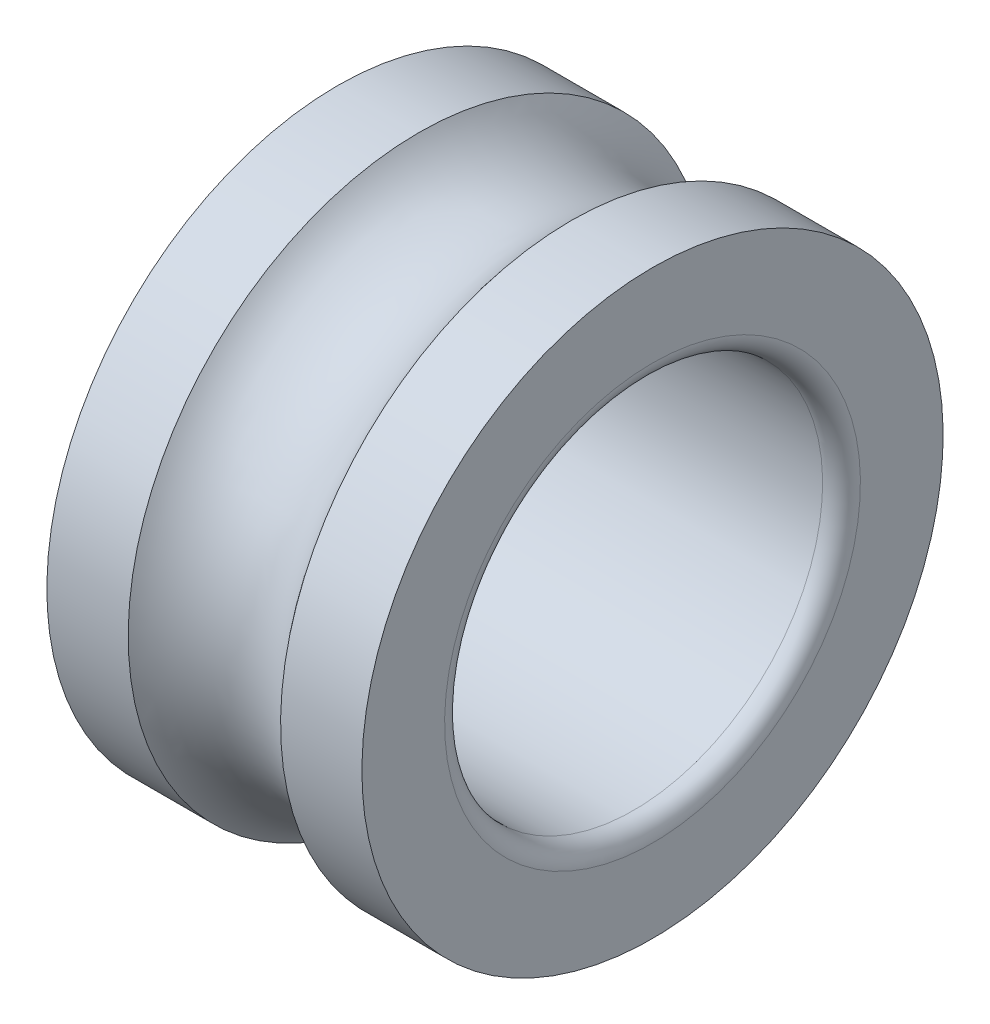
ISO-10303-21;
HEADER;
FILE_DESCRIPTION(('STEP AP214'),'2;1');
FILE_NAME('part.step','',(''),(''),'','','');
FILE_SCHEMA(('AUTOMOTIVE_DESIGN { 1 0 10303 214 1 1 1 1 }'));
ENDSEC;
DATA;
#1=APPLICATION_CONTEXT('core data for automotive mechanical design processes');
#2=APPLICATION_PROTOCOL_DEFINITION('international standard','automotive_design',2000,#1);
#3=PRODUCT_CONTEXT('',#1,'mechanical');
#4=PRODUCT('Part','Part','',(#3));
#5=PRODUCT_RELATED_PRODUCT_CATEGORY('part','',(#4));
#6=PRODUCT_DEFINITION_FORMATION('','',#4);
#7=PRODUCT_DEFINITION_CONTEXT('part definition',#1,'design');
#8=PRODUCT_DEFINITION('design','',#6,#7);
#9=PRODUCT_DEFINITION_SHAPE('','',#8);
#10=(LENGTH_UNIT() NAMED_UNIT(*) SI_UNIT(.MILLI.,.METRE.));
#11=(NAMED_UNIT(*) PLANE_ANGLE_UNIT() SI_UNIT($,.RADIAN.));
#12=(NAMED_UNIT(*) SI_UNIT($,.STERADIAN.) SOLID_ANGLE_UNIT());
#13=UNCERTAINTY_MEASURE_WITH_UNIT(LENGTH_MEASURE(1.E-05),#10,'distance_accuracy_value','');
#14=(GEOMETRIC_REPRESENTATION_CONTEXT(3) GLOBAL_UNCERTAINTY_ASSIGNED_CONTEXT((#13)) GLOBAL_UNIT_ASSIGNED_CONTEXT((#10,
#11,#12)) REPRESENTATION_CONTEXT('',''));
#15=CARTESIAN_POINT('',(0.,0.,0.));
#16=DIRECTION('',(0.,0.,1.));
#17=DIRECTION('',(1.,0.,0.));
#18=AXIS2_PLACEMENT_3D('',#15,#16,#17);
#19=CARTESIAN_POINT('',(8.70927405909496,0.,0.));
#20=DIRECTION('',(-1.,0.,0.));
#21=DIRECTION('',(0.,1.,0.));
#22=AXIS2_PLACEMENT_3D('',#19,#20,#21);
#23=CYLINDRICAL_SURFACE('',#22,9.225);
#24=CARTESIAN_POINT('',(7.41854811818992,0.,0.));
#25=DIRECTION('',(1.,0.,0.));
#26=DIRECTION('',(0.,1.,0.));
#27=AXIS2_PLACEMENT_3D('',#24,#25,#26);
#28=CIRCLE('',#27,9.225);
#29=CARTESIAN_POINT('',(7.41854811818992,9.225,0.));
#30=VERTEX_POINT('',#29);
#31=EDGE_CURVE('E11',#30,#30,#28,.T.);
#32=ORIENTED_EDGE('',*,*,#31,.T.);
#33=EDGE_LOOP('',(#32));
#34=FACE_BOUND('',#33,.T.);
#35=CARTESIAN_POINT('',(10.,0.,0.));
#36=DIRECTION('',(1.,0.,0.));
#37=DIRECTION('',(0.,1.,0.));
#38=AXIS2_PLACEMENT_3D('',#35,#36,#37);
#39=CIRCLE('',#38,9.225);
#40=CARTESIAN_POINT('',(10.,9.225,0.));
#41=VERTEX_POINT('',#40);
#42=EDGE_CURVE('E61',#41,#41,#39,.T.);
#43=ORIENTED_EDGE('',*,*,#42,.F.);
#44=EDGE_LOOP('',(#43));
#45=FACE_BOUND('',#44,.T.);
#46=ADVANCED_FACE('F16',(#34,#45),#23,.T.);
#47=CARTESIAN_POINT('',(5.,0.,0.));
#48=DIRECTION('',(1.,0.,0.));
#49=DIRECTION('',(0.,0.,-1.));
#50=AXIS2_PLACEMENT_3D('',#47,#48,#49);
#51=TOROIDAL_SURFACE('',#50,11.,3.);
#52=CARTESIAN_POINT('',(2.58145188181008,0.,0.));
#53=DIRECTION('',(1.,0.,0.));
#54=DIRECTION('',(0.,1.,0.));
#55=AXIS2_PLACEMENT_3D('',#52,#53,#54);
#56=CIRCLE('',#55,9.225);
#57=CARTESIAN_POINT('',(2.58145188181008,9.225,0.));
#58=VERTEX_POINT('',#57);
#59=EDGE_CURVE('E20',#58,#58,#56,.T.);
#60=ORIENTED_EDGE('',*,*,#59,.T.);
#61=EDGE_LOOP('',(#60));
#62=FACE_BOUND('',#61,.T.);
#63=ORIENTED_EDGE('',*,*,#31,.F.);
#64=EDGE_LOOP('',(#63));
#65=FACE_BOUND('',#64,.T.);
#66=ADVANCED_FACE('F83',(#62,#65),#51,.F.);
#67=CARTESIAN_POINT('',(1.29072594090504,0.,0.));
#68=DIRECTION('',(-1.,0.,0.));
#69=DIRECTION('',(0.,1.,0.));
#70=AXIS2_PLACEMENT_3D('',#67,#68,#69);
#71=CYLINDRICAL_SURFACE('',#70,9.225);
#72=CARTESIAN_POINT('',(0.,0.,0.));
#73=DIRECTION('',(1.,0.,0.));
#74=DIRECTION('',(0.,1.,0.));
#75=AXIS2_PLACEMENT_3D('',#72,#73,#74);
#76=CIRCLE('',#75,9.225);
#77=CARTESIAN_POINT('',(0.,9.225,0.));
#78=VERTEX_POINT('',#77);
#79=EDGE_CURVE('E49',#78,#78,#76,.T.);
#80=ORIENTED_EDGE('',*,*,#79,.T.);
#81=EDGE_LOOP('',(#80));
#82=FACE_BOUND('',#81,.T.);
#83=ORIENTED_EDGE('',*,*,#59,.F.);
#84=EDGE_LOOP('',(#83));
#85=FACE_BOUND('',#84,.T.);
#86=ADVANCED_FACE('F50',(#82,#85),#71,.T.);
#87=CARTESIAN_POINT('',(0.,7.9125,0.));
#88=DIRECTION('',(-1.,0.,0.));
#89=DIRECTION('',(0.,-1.,0.));
#90=AXIS2_PLACEMENT_3D('',#87,#88,#89);
#91=PLANE('',#90);
#92=CARTESIAN_POINT('',(0.,0.,0.));
#93=DIRECTION('',(1.,0.,0.));
#94=DIRECTION('',(0.,1.,0.));
#95=AXIS2_PLACEMENT_3D('',#92,#93,#94);
#96=CIRCLE('',#95,6.6);
#97=CARTESIAN_POINT('',(0.,6.6,0.));
#98=VERTEX_POINT('',#97);
#99=EDGE_CURVE('E53',#98,#98,#96,.T.);
#100=ORIENTED_EDGE('',*,*,#99,.T.);
#101=EDGE_LOOP('',(#100));
#102=FACE_BOUND('',#101,.T.);
#103=ORIENTED_EDGE('',*,*,#79,.F.);
#104=EDGE_LOOP('',(#103));
#105=FACE_BOUND('',#104,.T.);
#106=ADVANCED_FACE('F93',(#102,#105),#91,.T.);
#107=CARTESIAN_POINT('',(0.6,0.,0.));
#108=DIRECTION('',(1.,0.,0.));
#109=DIRECTION('',(0.,0.,-1.));
#110=AXIS2_PLACEMENT_3D('',#107,#108,#109);
#111=TOROIDAL_SURFACE('',#110,6.6,0.6);
#112=CARTESIAN_POINT('',(0.6,0.,0.));
#113=DIRECTION('',(1.,0.,0.));
#114=DIRECTION('',(0.,1.,0.));
#115=AXIS2_PLACEMENT_3D('',#112,#113,#114);
#116=CIRCLE('',#115,6.);
#117=CARTESIAN_POINT('',(0.6,6.,0.));
#118=VERTEX_POINT('',#117);
#119=EDGE_CURVE('E55',#118,#118,#116,.T.);
#120=ORIENTED_EDGE('',*,*,#119,.T.);
#121=EDGE_LOOP('',(#120));
#122=FACE_BOUND('',#121,.T.);
#123=ORIENTED_EDGE('',*,*,#99,.F.);
#124=EDGE_LOOP('',(#123));
#125=FACE_BOUND('',#124,.T.);
#126=ADVANCED_FACE('F18',(#122,#125),#111,.T.);
#127=CARTESIAN_POINT('',(5.,0.,0.));
#128=DIRECTION('',(-1.,0.,0.));
#129=DIRECTION('',(0.,1.,0.));
#130=AXIS2_PLACEMENT_3D('',#127,#128,#129);
#131=CYLINDRICAL_SURFACE('',#130,6.);
#132=CARTESIAN_POINT('',(9.4,0.,0.));
#133=DIRECTION('',(1.,0.,0.));
#134=DIRECTION('',(0.,1.,0.));
#135=AXIS2_PLACEMENT_3D('',#132,#133,#134);
#136=CIRCLE('',#135,6.);
#137=CARTESIAN_POINT('',(9.4,6.,0.));
#138=VERTEX_POINT('',#137);
#139=EDGE_CURVE('E60',#138,#138,#136,.T.);
#140=ORIENTED_EDGE('',*,*,#139,.T.);
#141=EDGE_LOOP('',(#140));
#142=FACE_BOUND('',#141,.T.);
#143=ORIENTED_EDGE('',*,*,#119,.F.);
#144=EDGE_LOOP('',(#143));
#145=FACE_BOUND('',#144,.T.);
#146=ADVANCED_FACE('F79',(#142,#145),#131,.F.);
#147=CARTESIAN_POINT('',(9.4,0.,0.));
#148=DIRECTION('',(1.,0.,0.));
#149=DIRECTION('',(0.,0.,-1.));
#150=AXIS2_PLACEMENT_3D('',#147,#148,#149);
#151=TOROIDAL_SURFACE('',#150,6.6,0.6);
#152=CARTESIAN_POINT('',(10.,0.,0.));
#153=DIRECTION('',(1.,0.,0.));
#154=DIRECTION('',(0.,1.,0.));
#155=AXIS2_PLACEMENT_3D('',#152,#153,#154);
#156=CIRCLE('',#155,6.6);
#157=CARTESIAN_POINT('',(10.,6.6,0.));
#158=VERTEX_POINT('',#157);
#159=EDGE_CURVE('E58',#158,#158,#156,.T.);
#160=ORIENTED_EDGE('',*,*,#159,.T.);
#161=EDGE_LOOP('',(#160));
#162=FACE_BOUND('',#161,.T.);
#163=ORIENTED_EDGE('',*,*,#139,.F.);
#164=EDGE_LOOP('',(#163));
#165=FACE_BOUND('',#164,.T.);
#166=ADVANCED_FACE('F70',(#162,#165),#151,.T.);
#167=CARTESIAN_POINT('',(10.,7.9125,0.));
#168=DIRECTION('',(1.,0.,0.));
#169=DIRECTION('',(0.,1.,0.));
#170=AXIS2_PLACEMENT_3D('',#167,#168,#169);
#171=PLANE('',#170);
#172=ORIENTED_EDGE('',*,*,#42,.T.);
#173=EDGE_LOOP('',(#172));
#174=FACE_BOUND('',#173,.T.);
#175=ORIENTED_EDGE('',*,*,#159,.F.);
#176=EDGE_LOOP('',(#175));
#177=FACE_BOUND('',#176,.T.);
#178=ADVANCED_FACE('F73',(#174,#177),#171,.T.);
#179=CLOSED_SHELL('',(#46,#66,#86,#106,#126,#146,#166,#178));
#180=MANIFOLD_SOLID_BREP('B1',#179);
#181=ADVANCED_BREP_SHAPE_REPRESENTATION('',(#18,#180),#14);
#182=SHAPE_DEFINITION_REPRESENTATION(#9,#181);
ENDSEC;
END-ISO-10303-21;
